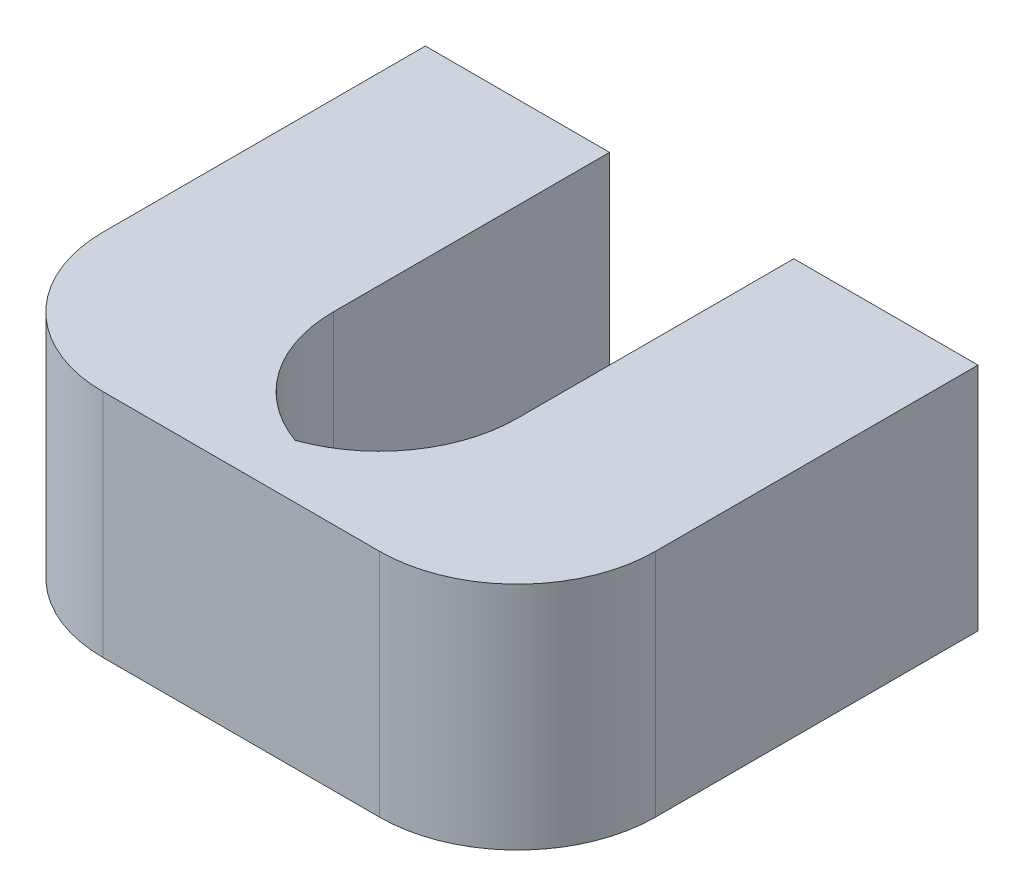
ISO-10303-21;
HEADER;
FILE_DESCRIPTION(('STEP AP214'),'2;1');
FILE_NAME('part.step','',(''),(''),'','','');
FILE_SCHEMA(('AUTOMOTIVE_DESIGN { 1 0 10303 214 1 1 1 1 }'));
ENDSEC;
DATA;
#1=APPLICATION_CONTEXT('core data for automotive mechanical design processes');
#2=APPLICATION_PROTOCOL_DEFINITION('international standard','automotive_design',2000,#1);
#3=PRODUCT_CONTEXT('',#1,'mechanical');
#4=PRODUCT('Part','Part','',(#3));
#5=PRODUCT_RELATED_PRODUCT_CATEGORY('part','',(#4));
#6=PRODUCT_DEFINITION_FORMATION('','',#4);
#7=PRODUCT_DEFINITION_CONTEXT('part definition',#1,'design');
#8=PRODUCT_DEFINITION('design','',#6,#7);
#9=PRODUCT_DEFINITION_SHAPE('','',#8);
#10=(LENGTH_UNIT() NAMED_UNIT(*) SI_UNIT(.MILLI.,.METRE.));
#11=(NAMED_UNIT(*) PLANE_ANGLE_UNIT() SI_UNIT($,.RADIAN.));
#12=(NAMED_UNIT(*) SI_UNIT($,.STERADIAN.) SOLID_ANGLE_UNIT());
#13=UNCERTAINTY_MEASURE_WITH_UNIT(LENGTH_MEASURE(1.E-05),#10,'distance_accuracy_value','');
#14=(GEOMETRIC_REPRESENTATION_CONTEXT(3) GLOBAL_UNCERTAINTY_ASSIGNED_CONTEXT((#13)) GLOBAL_UNIT_ASSIGNED_CONTEXT((#10,
#11,#12)) REPRESENTATION_CONTEXT('',''));
#15=CARTESIAN_POINT('',(0.,0.,0.));
#16=DIRECTION('',(0.,0.,1.));
#17=DIRECTION('',(1.,0.,0.));
#18=AXIS2_PLACEMENT_3D('',#15,#16,#17);
#19=CARTESIAN_POINT('',(-3.,-5.,10.));
#20=DIRECTION('',(0.,0.,1.));
#21=DIRECTION('',(1.,0.,0.));
#22=AXIS2_PLACEMENT_3D('',#19,#20,#21);
#23=PLANE('',#22);
#24=DIRECTION('',(1.,0.,0.));
#25=VECTOR('',#24,1.);
#26=CARTESIAN_POINT('',(-3.,-5.,10.));
#27=LINE('',#26,#25);
#28=CARTESIAN_POINT('',(-3.,-5.,10.));
#29=VERTEX_POINT('',#28);
#30=CARTESIAN_POINT('',(3.,-5.,10.));
#31=VERTEX_POINT('',#30);
#32=EDGE_CURVE('E11',#29,#31,#27,.T.);
#33=ORIENTED_EDGE('',*,*,#32,.T.);
#34=DIRECTION('',(0.,1.,0.));
#35=VECTOR('',#34,1.);
#36=CARTESIAN_POINT('',(3.,0.,10.));
#37=LINE('',#36,#35);
#38=CARTESIAN_POINT('',(3.,0.,10.));
#39=VERTEX_POINT('',#38);
#40=EDGE_CURVE('E24',#31,#39,#37,.T.);
#41=ORIENTED_EDGE('',*,*,#40,.T.);
#42=DIRECTION('',(1.,0.,0.));
#43=VECTOR('',#42,1.);
#44=CARTESIAN_POINT('',(-3.,0.,10.));
#45=LINE('',#44,#43);
#46=CARTESIAN_POINT('',(-3.,0.,10.));
#47=VERTEX_POINT('',#46);
#48=EDGE_CURVE('E186',#47,#39,#45,.T.);
#49=ORIENTED_EDGE('',*,*,#48,.F.);
#50=DIRECTION('',(0.,1.,0.));
#51=VECTOR('',#50,1.);
#52=CARTESIAN_POINT('',(-3.,-5.,10.));
#53=LINE('',#52,#51);
#54=EDGE_CURVE('E184',#47,#29,#53,.F.);
#55=ORIENTED_EDGE('',*,*,#54,.T.);
#56=EDGE_LOOP('',(#33,#41,#49,#55));
#57=FACE_BOUND('',#56,.T.);
#58=ADVANCED_FACE('F17',(#57),#23,.T.);
#59=CARTESIAN_POINT('',(-6.,-5.,5.));
#60=DIRECTION('',(-1.,0.,0.));
#61=DIRECTION('',(0.,0.,1.));
#62=AXIS2_PLACEMENT_3D('',#59,#60,#61);
#63=PLANE('',#62);
#64=DIRECTION('',(0.,0.,1.));
#65=VECTOR('',#64,1.);
#66=CARTESIAN_POINT('',(-6.,-5.,5.));
#67=LINE('',#66,#65);
#68=CARTESIAN_POINT('',(-6.,-5.,0.));
#69=VERTEX_POINT('',#68);
#70=CARTESIAN_POINT('',(-6.,-5.,7.));
#71=VERTEX_POINT('',#70);
#72=EDGE_CURVE('E182',#69,#71,#67,.T.);
#73=ORIENTED_EDGE('',*,*,#72,.T.);
#74=DIRECTION('',(0.,1.,0.));
#75=VECTOR('',#74,1.);
#76=CARTESIAN_POINT('',(-6.,-5.,7.));
#77=LINE('',#76,#75);
#78=CARTESIAN_POINT('',(-6.,0.,7.));
#79=VERTEX_POINT('',#78);
#80=EDGE_CURVE('E180',#71,#79,#77,.T.);
#81=ORIENTED_EDGE('',*,*,#80,.T.);
#82=DIRECTION('',(0.,0.,1.));
#83=VECTOR('',#82,1.);
#84=CARTESIAN_POINT('',(-6.,0.,5.));
#85=LINE('',#84,#83);
#86=CARTESIAN_POINT('',(-6.,0.,0.));
#87=VERTEX_POINT('',#86);
#88=EDGE_CURVE('E177',#87,#79,#85,.T.);
#89=ORIENTED_EDGE('',*,*,#88,.F.);
#90=DIRECTION('',(0.,1.,0.));
#91=VECTOR('',#90,1.);
#92=CARTESIAN_POINT('',(-6.,-5.,0.));
#93=LINE('',#92,#91);
#94=EDGE_CURVE('E174',#69,#87,#93,.T.);
#95=ORIENTED_EDGE('',*,*,#94,.F.);
#96=EDGE_LOOP('',(#73,#81,#89,#95));
#97=FACE_BOUND('',#96,.T.);
#98=ADVANCED_FACE('F213',(#97),#63,.T.);
#99=CARTESIAN_POINT('',(-4.,-5.,0.));
#100=DIRECTION('',(0.,0.,-1.));
#101=DIRECTION('',(-1.,0.,0.));
#102=AXIS2_PLACEMENT_3D('',#99,#100,#101);
#103=PLANE('',#102);
#104=DIRECTION('',(-1.,0.,0.));
#105=VECTOR('',#104,1.);
#106=CARTESIAN_POINT('',(-4.,0.,0.));
#107=LINE('',#106,#105);
#108=CARTESIAN_POINT('',(-2.,0.,0.));
#109=VERTEX_POINT('',#108);
#110=EDGE_CURVE('E171',#109,#87,#107,.T.);
#111=ORIENTED_EDGE('',*,*,#110,.F.);
#112=DIRECTION('',(0.,1.,0.));
#113=VECTOR('',#112,1.);
#114=CARTESIAN_POINT('',(-2.,-5.,0.));
#115=LINE('',#114,#113);
#116=CARTESIAN_POINT('',(-2.,-5.,0.));
#117=VERTEX_POINT('',#116);
#118=EDGE_CURVE('E168',#117,#109,#115,.T.);
#119=ORIENTED_EDGE('',*,*,#118,.F.);
#120=DIRECTION('',(-1.,0.,0.));
#121=VECTOR('',#120,1.);
#122=CARTESIAN_POINT('',(-4.,-5.,0.));
#123=LINE('',#122,#121);
#124=EDGE_CURVE('E165',#117,#69,#123,.T.);
#125=ORIENTED_EDGE('',*,*,#124,.T.);
#126=ORIENTED_EDGE('',*,*,#94,.T.);
#127=EDGE_LOOP('',(#111,#119,#125,#126));
#128=FACE_BOUND('',#127,.T.);
#129=ADVANCED_FACE('F211',(#128),#103,.T.);
#130=CARTESIAN_POINT('',(-2.,-5.,4.5));
#131=DIRECTION('',(1.,0.,0.));
#132=DIRECTION('',(0.,0.,-1.));
#133=AXIS2_PLACEMENT_3D('',#130,#131,#132);
#134=PLANE('',#133);
#135=DIRECTION('',(0.,0.,-1.));
#136=VECTOR('',#135,1.);
#137=CARTESIAN_POINT('',(-2.,0.,4.5));
#138=LINE('',#137,#136);
#139=CARTESIAN_POINT('',(-2.,0.,6.));
#140=VERTEX_POINT('',#139);
#141=EDGE_CURVE('E163',#140,#109,#138,.T.);
#142=ORIENTED_EDGE('',*,*,#141,.F.);
#143=DIRECTION('',(0.,1.,0.));
#144=VECTOR('',#143,1.);
#145=CARTESIAN_POINT('',(-2.,-5.,6.));
#146=LINE('',#145,#144);
#147=CARTESIAN_POINT('',(-2.,-5.,6.));
#148=VERTEX_POINT('',#147);
#149=EDGE_CURVE('E115',#140,#148,#146,.F.);
#150=ORIENTED_EDGE('',*,*,#149,.T.);
#151=DIRECTION('',(0.,0.,-1.));
#152=VECTOR('',#151,1.);
#153=CARTESIAN_POINT('',(-2.,-5.,4.5));
#154=LINE('',#153,#152);
#155=EDGE_CURVE('E159',#148,#117,#154,.T.);
#156=ORIENTED_EDGE('',*,*,#155,.T.);
#157=ORIENTED_EDGE('',*,*,#118,.T.);
#158=EDGE_LOOP('',(#142,#150,#156,#157));
#159=FACE_BOUND('',#158,.T.);
#160=ADVANCED_FACE('F209',(#159),#134,.T.);
#161=CARTESIAN_POINT('',(2.,-5.,4.5));
#162=DIRECTION('',(1.,0.,0.));
#163=DIRECTION('',(0.,0.,-1.));
#164=AXIS2_PLACEMENT_3D('',#161,#162,#163);
#165=PLANE('',#164);
#166=DIRECTION('',(0.,0.,-1.));
#167=VECTOR('',#166,1.);
#168=CARTESIAN_POINT('',(2.,-5.,4.5));
#169=LINE('',#168,#167);
#170=CARTESIAN_POINT('',(2.,-5.,6.));
#171=VERTEX_POINT('',#170);
#172=CARTESIAN_POINT('',(2.,-5.,0.));
#173=VERTEX_POINT('',#172);
#174=EDGE_CURVE('E156',#171,#173,#169,.T.);
#175=ORIENTED_EDGE('',*,*,#174,.F.);
#176=DIRECTION('',(0.,1.,0.));
#177=VECTOR('',#176,1.);
#178=CARTESIAN_POINT('',(2.,0.,6.));
#179=LINE('',#178,#177);
#180=CARTESIAN_POINT('',(2.,0.,6.));
#181=VERTEX_POINT('',#180);
#182=EDGE_CURVE('E154',#171,#181,#179,.T.);
#183=ORIENTED_EDGE('',*,*,#182,.T.);
#184=DIRECTION('',(0.,0.,-1.));
#185=VECTOR('',#184,1.);
#186=CARTESIAN_POINT('',(2.,0.,4.5));
#187=LINE('',#186,#185);
#188=CARTESIAN_POINT('',(2.,0.,0.));
#189=VERTEX_POINT('',#188);
#190=EDGE_CURVE('E103',#181,#189,#187,.T.);
#191=ORIENTED_EDGE('',*,*,#190,.T.);
#192=DIRECTION('',(0.,1.,0.));
#193=VECTOR('',#192,1.);
#194=CARTESIAN_POINT('',(2.,-5.,0.));
#195=LINE('',#194,#193);
#196=EDGE_CURVE('E150',#173,#189,#195,.T.);
#197=ORIENTED_EDGE('',*,*,#196,.F.);
#198=EDGE_LOOP('',(#175,#183,#191,#197));
#199=FACE_BOUND('',#198,.T.);
#200=ADVANCED_FACE('F204',(#199),#165,.F.);
#201=CARTESIAN_POINT('',(4.,-5.,0.));
#202=DIRECTION('',(0.,0.,1.));
#203=DIRECTION('',(1.,0.,0.));
#204=AXIS2_PLACEMENT_3D('',#201,#202,#203);
#205=PLANE('',#204);
#206=DIRECTION('',(1.,0.,0.));
#207=VECTOR('',#206,1.);
#208=CARTESIAN_POINT('',(4.,0.,0.));
#209=LINE('',#208,#207);
#210=CARTESIAN_POINT('',(6.,0.,0.));
#211=VERTEX_POINT('',#210);
#212=EDGE_CURVE('E148',#189,#211,#209,.T.);
#213=ORIENTED_EDGE('',*,*,#212,.T.);
#214=DIRECTION('',(0.,1.,0.));
#215=VECTOR('',#214,1.);
#216=CARTESIAN_POINT('',(6.,-5.,0.));
#217=LINE('',#216,#215);
#218=CARTESIAN_POINT('',(6.,-5.,0.));
#219=VERTEX_POINT('',#218);
#220=EDGE_CURVE('E145',#219,#211,#217,.T.);
#221=ORIENTED_EDGE('',*,*,#220,.F.);
#222=DIRECTION('',(1.,0.,0.));
#223=VECTOR('',#222,1.);
#224=CARTESIAN_POINT('',(4.,-5.,0.));
#225=LINE('',#224,#223);
#226=EDGE_CURVE('E142',#173,#219,#225,.T.);
#227=ORIENTED_EDGE('',*,*,#226,.F.);
#228=ORIENTED_EDGE('',*,*,#196,.T.);
#229=EDGE_LOOP('',(#213,#221,#227,#228));
#230=FACE_BOUND('',#229,.T.);
#231=ADVANCED_FACE('F202',(#230),#205,.F.);
#232=CARTESIAN_POINT('',(6.,-5.,5.));
#233=DIRECTION('',(-1.,0.,0.));
#234=DIRECTION('',(0.,0.,1.));
#235=AXIS2_PLACEMENT_3D('',#232,#233,#234);
#236=PLANE('',#235);
#237=DIRECTION('',(0.,0.,1.));
#238=VECTOR('',#237,1.);
#239=CARTESIAN_POINT('',(6.,0.,5.));
#240=LINE('',#239,#238);
#241=CARTESIAN_POINT('',(6.,0.,7.));
#242=VERTEX_POINT('',#241);
#243=EDGE_CURVE('E140',#211,#242,#240,.T.);
#244=ORIENTED_EDGE('',*,*,#243,.T.);
#245=DIRECTION('',(0.,1.,0.));
#246=VECTOR('',#245,1.);
#247=CARTESIAN_POINT('',(6.,-5.,7.));
#248=LINE('',#247,#246);
#249=CARTESIAN_POINT('',(6.,-5.,7.));
#250=VERTEX_POINT('',#249);
#251=EDGE_CURVE('E138',#242,#250,#248,.F.);
#252=ORIENTED_EDGE('',*,*,#251,.T.);
#253=DIRECTION('',(0.,0.,1.));
#254=VECTOR('',#253,1.);
#255=CARTESIAN_POINT('',(6.,-5.,5.));
#256=LINE('',#255,#254);
#257=EDGE_CURVE('E135',#219,#250,#256,.T.);
#258=ORIENTED_EDGE('',*,*,#257,.F.);
#259=ORIENTED_EDGE('',*,*,#220,.T.);
#260=EDGE_LOOP('',(#244,#252,#258,#259));
#261=FACE_BOUND('',#260,.T.);
#262=ADVANCED_FACE('F197',(#261),#236,.F.);
#263=CARTESIAN_POINT('',(0.,-5.,5.));
#264=DIRECTION('',(0.,-1.,0.));
#265=DIRECTION('',(1.,0.,0.));
#266=AXIS2_PLACEMENT_3D('',#263,#264,#265);
#267=PLANE('',#266);
#268=ORIENTED_EDGE('',*,*,#257,.T.);
#269=CARTESIAN_POINT('',(3.,-5.,7.));
#270=DIRECTION('',(0.,-1.,0.));
#271=DIRECTION('',(0.,0.,-1.));
#272=AXIS2_PLACEMENT_3D('',#269,#270,#271);
#273=CIRCLE('',#272,3.);
#274=EDGE_CURVE('E133',#250,#31,#273,.T.);
#275=ORIENTED_EDGE('',*,*,#274,.T.);
#276=ORIENTED_EDGE('',*,*,#32,.F.);
#277=CARTESIAN_POINT('',(-3.,-5.,7.));
#278=DIRECTION('',(0.,-1.,0.));
#279=DIRECTION('',(0.,0.,-1.));
#280=AXIS2_PLACEMENT_3D('',#277,#278,#279);
#281=CIRCLE('',#280,3.);
#282=EDGE_CURVE('E130',#29,#71,#281,.T.);
#283=ORIENTED_EDGE('',*,*,#282,.T.);
#284=ORIENTED_EDGE('',*,*,#72,.F.);
#285=ORIENTED_EDGE('',*,*,#124,.F.);
#286=ORIENTED_EDGE('',*,*,#155,.F.);
#287=CARTESIAN_POINT('',(1.,-5.,6.));
#288=DIRECTION('',(0.,-1.,0.));
#289=DIRECTION('',(0.,0.,-1.));
#290=AXIS2_PLACEMENT_3D('',#287,#288,#289);
#291=CIRCLE('',#290,3.);
#292=CARTESIAN_POINT('',(0.,-5.,8.82842712474619));
#293=VERTEX_POINT('',#292);
#294=EDGE_CURVE('E128',#148,#293,#291,.F.);
#295=ORIENTED_EDGE('',*,*,#294,.T.);
#296=CARTESIAN_POINT('',(-1.,-5.,6.));
#297=DIRECTION('',(0.,-1.,0.));
#298=DIRECTION('',(0.,0.,-1.));
#299=AXIS2_PLACEMENT_3D('',#296,#297,#298);
#300=CIRCLE('',#299,3.);
#301=EDGE_CURVE('E120',#293,#171,#300,.F.);
#302=ORIENTED_EDGE('',*,*,#301,.T.);
#303=ORIENTED_EDGE('',*,*,#174,.T.);
#304=ORIENTED_EDGE('',*,*,#226,.T.);
#305=EDGE_LOOP('',(#268,#275,#276,#283,#284,#285,#286,#295,#302,#303,#304));
#306=FACE_BOUND('',#305,.T.);
#307=ADVANCED_FACE('F199',(#306),#267,.T.);
#308=CARTESIAN_POINT('',(0.,0.,5.));
#309=DIRECTION('',(0.,-1.,0.));
#310=DIRECTION('',(1.,0.,0.));
#311=AXIS2_PLACEMENT_3D('',#308,#309,#310);
#312=PLANE('',#311);
#313=ORIENTED_EDGE('',*,*,#48,.T.);
#314=CARTESIAN_POINT('',(3.,0.,7.));
#315=DIRECTION('',(0.,-1.,0.));
#316=DIRECTION('',(0.,0.,-1.));
#317=AXIS2_PLACEMENT_3D('',#314,#315,#316);
#318=CIRCLE('',#317,3.);
#319=EDGE_CURVE('E107',#39,#242,#318,.F.);
#320=ORIENTED_EDGE('',*,*,#319,.T.);
#321=ORIENTED_EDGE('',*,*,#243,.F.);
#322=ORIENTED_EDGE('',*,*,#212,.F.);
#323=ORIENTED_EDGE('',*,*,#190,.F.);
#324=CARTESIAN_POINT('',(-1.,0.,6.));
#325=DIRECTION('',(0.,-1.,0.));
#326=DIRECTION('',(0.,0.,-1.));
#327=AXIS2_PLACEMENT_3D('',#324,#325,#326);
#328=CIRCLE('',#327,3.);
#329=CARTESIAN_POINT('',(0.,0.,8.82842712474619));
#330=VERTEX_POINT('',#329);
#331=EDGE_CURVE('E96',#181,#330,#328,.T.);
#332=ORIENTED_EDGE('',*,*,#331,.T.);
#333=CARTESIAN_POINT('',(1.,0.,6.));
#334=DIRECTION('',(0.,-1.,0.));
#335=DIRECTION('',(0.,0.,-1.));
#336=AXIS2_PLACEMENT_3D('',#333,#334,#335);
#337=CIRCLE('',#336,3.);
#338=EDGE_CURVE('E100',#330,#140,#337,.T.);
#339=ORIENTED_EDGE('',*,*,#338,.T.);
#340=ORIENTED_EDGE('',*,*,#141,.T.);
#341=ORIENTED_EDGE('',*,*,#110,.T.);
#342=ORIENTED_EDGE('',*,*,#88,.T.);
#343=CARTESIAN_POINT('',(-3.,0.,7.));
#344=DIRECTION('',(0.,-1.,0.));
#345=DIRECTION('',(0.,0.,-1.));
#346=AXIS2_PLACEMENT_3D('',#343,#344,#345);
#347=CIRCLE('',#346,3.);
#348=EDGE_CURVE('E116',#79,#47,#347,.F.);
#349=ORIENTED_EDGE('',*,*,#348,.T.);
#350=EDGE_LOOP('',(#313,#320,#321,#322,#323,#332,#339,#340,#341,#342,#349));
#351=FACE_BOUND('',#350,.T.);
#352=ADVANCED_FACE('F98',(#351),#312,.F.);
#353=CARTESIAN_POINT('',(3.,-5.,7.));
#354=DIRECTION('',(0.,-1.,0.));
#355=DIRECTION('',(0.,0.,-1.));
#356=AXIS2_PLACEMENT_3D('',#353,#354,#355);
#357=CYLINDRICAL_SURFACE('',#356,3.);
#358=ORIENTED_EDGE('',*,*,#274,.F.);
#359=ORIENTED_EDGE('',*,*,#251,.F.);
#360=ORIENTED_EDGE('',*,*,#319,.F.);
#361=ORIENTED_EDGE('',*,*,#40,.F.);
#362=EDGE_LOOP('',(#358,#359,#360,#361));
#363=FACE_BOUND('',#362,.T.);
#364=ADVANCED_FACE('F194',(#363),#357,.T.);
#365=CARTESIAN_POINT('',(1.,-5.,6.));
#366=DIRECTION('',(0.,1.,0.));
#367=DIRECTION('',(0.,0.,1.));
#368=AXIS2_PLACEMENT_3D('',#365,#366,#367);
#369=CYLINDRICAL_SURFACE('',#368,3.);
#370=DIRECTION('',(0.,1.,0.));
#371=VECTOR('',#370,1.);
#372=CARTESIAN_POINT('',(0.,-2.5,8.82842712474619));
#373=LINE('',#372,#371);
#374=EDGE_CURVE('E113',#293,#330,#373,.T.);
#375=ORIENTED_EDGE('',*,*,#374,.F.);
#376=ORIENTED_EDGE('',*,*,#294,.F.);
#377=ORIENTED_EDGE('',*,*,#149,.F.);
#378=ORIENTED_EDGE('',*,*,#338,.F.);
#379=EDGE_LOOP('',(#375,#376,#377,#378));
#380=FACE_BOUND('',#379,.T.);
#381=ADVANCED_FACE('F111',(#380),#369,.F.);
#382=CARTESIAN_POINT('',(-1.,-5.,6.));
#383=DIRECTION('',(0.,-1.,0.));
#384=DIRECTION('',(0.,0.,-1.));
#385=AXIS2_PLACEMENT_3D('',#382,#383,#384);
#386=CYLINDRICAL_SURFACE('',#385,3.);
#387=ORIENTED_EDGE('',*,*,#301,.F.);
#388=ORIENTED_EDGE('',*,*,#374,.T.);
#389=ORIENTED_EDGE('',*,*,#331,.F.);
#390=ORIENTED_EDGE('',*,*,#182,.F.);
#391=EDGE_LOOP('',(#387,#388,#389,#390));
#392=FACE_BOUND('',#391,.T.);
#393=ADVANCED_FACE('F118',(#392),#386,.F.);
#394=CARTESIAN_POINT('',(-3.,-5.,7.));
#395=DIRECTION('',(0.,1.,0.));
#396=DIRECTION('',(0.,0.,1.));
#397=AXIS2_PLACEMENT_3D('',#394,#395,#396);
#398=CYLINDRICAL_SURFACE('',#397,3.);
#399=ORIENTED_EDGE('',*,*,#282,.F.);
#400=ORIENTED_EDGE('',*,*,#54,.F.);
#401=ORIENTED_EDGE('',*,*,#348,.F.);
#402=ORIENTED_EDGE('',*,*,#80,.F.);
#403=EDGE_LOOP('',(#399,#400,#401,#402));
#404=FACE_BOUND('',#403,.T.);
#405=ADVANCED_FACE('F217',(#404),#398,.T.);
#406=CLOSED_SHELL('',(#58,#98,#129,#160,#200,#231,#262,#307,#352,#364,#381,#393,#405));
#407=MANIFOLD_SOLID_BREP('B1',#406);
#408=ADVANCED_BREP_SHAPE_REPRESENTATION('',(#18,#407),#14);
#409=SHAPE_DEFINITION_REPRESENTATION(#9,#408);
ENDSEC;
END-ISO-10303-21;
